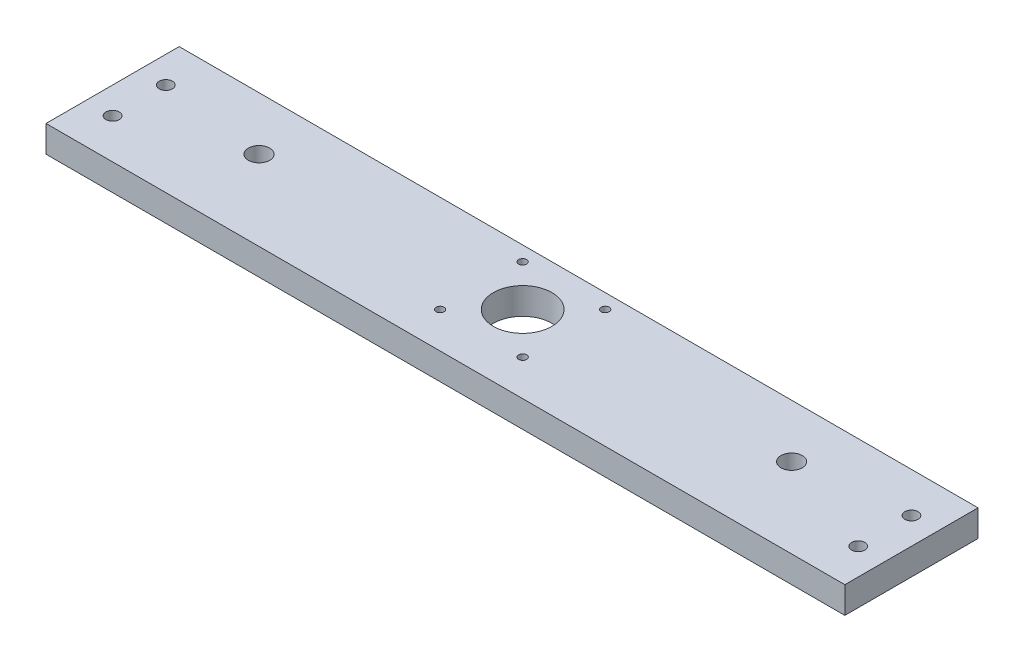
ISO-10303-21;
HEADER;
FILE_DESCRIPTION(('STEP AP214'),'2;1');
FILE_NAME('part.step','',(''),(''),'','','');
FILE_SCHEMA(('AUTOMOTIVE_DESIGN { 1 0 10303 214 1 1 1 1 }'));
ENDSEC;
DATA;
#1=APPLICATION_CONTEXT('core data for automotive mechanical design processes');
#2=APPLICATION_PROTOCOL_DEFINITION('international standard','automotive_design',2000,#1);
#3=PRODUCT_CONTEXT('',#1,'mechanical');
#4=PRODUCT('Part','Part','',(#3));
#5=PRODUCT_RELATED_PRODUCT_CATEGORY('part','',(#4));
#6=PRODUCT_DEFINITION_FORMATION('','',#4);
#7=PRODUCT_DEFINITION_CONTEXT('part definition',#1,'design');
#8=PRODUCT_DEFINITION('design','',#6,#7);
#9=PRODUCT_DEFINITION_SHAPE('','',#8);
#10=(LENGTH_UNIT() NAMED_UNIT(*) SI_UNIT(.MILLI.,.METRE.));
#11=(NAMED_UNIT(*) PLANE_ANGLE_UNIT() SI_UNIT($,.RADIAN.));
#12=(NAMED_UNIT(*) SI_UNIT($,.STERADIAN.) SOLID_ANGLE_UNIT());
#13=UNCERTAINTY_MEASURE_WITH_UNIT(LENGTH_MEASURE(1.E-05),#10,'distance_accuracy_value','');
#14=(GEOMETRIC_REPRESENTATION_CONTEXT(3) GLOBAL_UNCERTAINTY_ASSIGNED_CONTEXT((#13)) GLOBAL_UNIT_ASSIGNED_CONTEXT((#10,
#11,#12)) REPRESENTATION_CONTEXT('',''));
#15=CARTESIAN_POINT('',(0.,0.,0.));
#16=DIRECTION('',(0.,0.,1.));
#17=DIRECTION('',(1.,0.,0.));
#18=AXIS2_PLACEMENT_3D('',#15,#16,#17);
#19=CARTESIAN_POINT('',(0.,10.,0.));
#20=DIRECTION('',(0.,1.,0.));
#21=DIRECTION('',(0.,0.,1.));
#22=AXIS2_PLACEMENT_3D('',#19,#20,#21);
#23=PLANE('',#22);
#24=CARTESIAN_POINT('',(15.5,10.,-14.5));
#25=DIRECTION('',(0.,1.,0.));
#26=DIRECTION('',(0.,0.,-1.));
#27=AXIS2_PLACEMENT_3D('',#24,#25,#26);
#28=CIRCLE('',#27,1.5);
#29=CARTESIAN_POINT('',(15.5,10.,-16.));
#30=VERTEX_POINT('',#29);
#31=EDGE_CURVE('E155',#30,#30,#28,.T.);
#32=ORIENTED_EDGE('',*,*,#31,.F.);
#33=EDGE_LOOP('',(#32));
#34=FACE_BOUND('',#33,.T.);
#35=CARTESIAN_POINT('',(-15.5,10.,-14.5));
#36=DIRECTION('',(0.,1.,0.));
#37=DIRECTION('',(0.,0.,1.));
#38=AXIS2_PLACEMENT_3D('',#35,#36,#37);
#39=CIRCLE('',#38,1.5);
#40=CARTESIAN_POINT('',(-15.5,10.,-13.));
#41=VERTEX_POINT('',#40);
#42=EDGE_CURVE('E161',#41,#41,#39,.T.);
#43=ORIENTED_EDGE('',*,*,#42,.F.);
#44=EDGE_LOOP('',(#43));
#45=FACE_BOUND('',#44,.T.);
#46=CARTESIAN_POINT('',(-15.5,10.,16.5));
#47=DIRECTION('',(0.,1.,0.));
#48=DIRECTION('',(0.,0.,-1.));
#49=AXIS2_PLACEMENT_3D('',#46,#47,#48);
#50=CIRCLE('',#49,1.5);
#51=CARTESIAN_POINT('',(-15.5,10.,15.));
#52=VERTEX_POINT('',#51);
#53=EDGE_CURVE('E167',#52,#52,#50,.T.);
#54=ORIENTED_EDGE('',*,*,#53,.F.);
#55=EDGE_LOOP('',(#54));
#56=FACE_BOUND('',#55,.T.);
#57=CARTESIAN_POINT('',(15.5,10.,16.5));
#58=DIRECTION('',(0.,1.,0.));
#59=DIRECTION('',(0.,0.,1.));
#60=AXIS2_PLACEMENT_3D('',#57,#58,#59);
#61=CIRCLE('',#60,1.5);
#62=CARTESIAN_POINT('',(15.5,10.,18.));
#63=VERTEX_POINT('',#62);
#64=EDGE_CURVE('E173',#63,#63,#61,.T.);
#65=ORIENTED_EDGE('',*,*,#64,.F.);
#66=EDGE_LOOP('',(#65));
#67=FACE_BOUND('',#66,.T.);
#68=CARTESIAN_POINT('',(0.,10.,1.));
#69=DIRECTION('',(0.,1.,0.));
#70=DIRECTION('',(0.,0.,1.));
#71=AXIS2_PLACEMENT_3D('',#68,#69,#70);
#72=CIRCLE('',#71,11.);
#73=CARTESIAN_POINT('',(0.,10.,12.));
#74=VERTEX_POINT('',#73);
#75=EDGE_CURVE('E149',#74,#74,#72,.T.);
#76=ORIENTED_EDGE('',*,*,#75,.F.);
#77=EDGE_LOOP('',(#76));
#78=FACE_BOUND('',#77,.T.);
#79=CARTESIAN_POINT('',(140.,10.,-5.));
#80=DIRECTION('',(0.,1.,0.));
#81=DIRECTION('',(0.,0.,-1.));
#82=AXIS2_PLACEMENT_3D('',#79,#80,#81);
#83=CIRCLE('',#82,2.5);
#84=CARTESIAN_POINT('',(140.,10.,-7.49999999999999));
#85=VERTEX_POINT('',#84);
#86=EDGE_CURVE('E131',#85,#85,#83,.T.);
#87=ORIENTED_EDGE('',*,*,#86,.F.);
#88=EDGE_LOOP('',(#87));
#89=FACE_BOUND('',#88,.T.);
#90=CARTESIAN_POINT('',(140.,10.,15.));
#91=DIRECTION('',(0.,1.,0.));
#92=DIRECTION('',(0.,0.,1.));
#93=AXIS2_PLACEMENT_3D('',#90,#91,#92);
#94=CIRCLE('',#93,2.5);
#95=CARTESIAN_POINT('',(140.,10.,17.5));
#96=VERTEX_POINT('',#95);
#97=EDGE_CURVE('E138',#96,#96,#94,.T.);
#98=ORIENTED_EDGE('',*,*,#97,.F.);
#99=EDGE_LOOP('',(#98));
#100=FACE_BOUND('',#99,.T.);
#101=CARTESIAN_POINT('',(-140.,10.,15.));
#102=DIRECTION('',(0.,1.,0.));
#103=DIRECTION('',(0.,0.,-1.));
#104=AXIS2_PLACEMENT_3D('',#101,#102,#103);
#105=CIRCLE('',#104,2.5);
#106=CARTESIAN_POINT('',(-140.,10.,12.5));
#107=VERTEX_POINT('',#106);
#108=EDGE_CURVE('E144',#107,#107,#105,.T.);
#109=ORIENTED_EDGE('',*,*,#108,.F.);
#110=EDGE_LOOP('',(#109));
#111=FACE_BOUND('',#110,.T.);
#112=CARTESIAN_POINT('',(-140.,10.,-4.99999999999996));
#113=DIRECTION('',(0.,1.,0.));
#114=DIRECTION('',(0.,0.,1.));
#115=AXIS2_PLACEMENT_3D('',#112,#113,#114);
#116=CIRCLE('',#115,2.5);
#117=CARTESIAN_POINT('',(-140.,10.,-2.49999999999997));
#118=VERTEX_POINT('',#117);
#119=EDGE_CURVE('E125',#118,#118,#116,.T.);
#120=ORIENTED_EDGE('',*,*,#119,.F.);
#121=EDGE_LOOP('',(#120));
#122=FACE_BOUND('',#121,.T.);
#123=CARTESIAN_POINT('',(-100.,10.,0.));
#124=DIRECTION('',(0.,1.,0.));
#125=DIRECTION('',(0.,0.,1.));
#126=AXIS2_PLACEMENT_3D('',#123,#124,#125);
#127=CIRCLE('',#126,4.00000000000001);
#128=CARTESIAN_POINT('',(-100.,10.,4.00000000000002));
#129=VERTEX_POINT('',#128);
#130=EDGE_CURVE('E101',#129,#129,#127,.T.);
#131=ORIENTED_EDGE('',*,*,#130,.F.);
#132=EDGE_LOOP('',(#131));
#133=FACE_BOUND('',#132,.T.);
#134=DIRECTION('',(0.,0.,1.));
#135=VECTOR('',#134,1.);
#136=CARTESIAN_POINT('',(-150.,10.,30.));
#137=LINE('',#136,#135);
#138=CARTESIAN_POINT('',(-150.,10.,-20.));
#139=VERTEX_POINT('',#138);
#140=CARTESIAN_POINT('',(-150.,10.,30.));
#141=VERTEX_POINT('',#140);
#142=EDGE_CURVE('E86',#139,#141,#137,.T.);
#143=ORIENTED_EDGE('',*,*,#142,.T.);
#144=DIRECTION('',(1.,0.,0.));
#145=VECTOR('',#144,1.);
#146=CARTESIAN_POINT('',(150.,10.,30.));
#147=LINE('',#146,#145);
#148=CARTESIAN_POINT('',(150.,10.,30.));
#149=VERTEX_POINT('',#148);
#150=EDGE_CURVE('E81',#141,#149,#147,.T.);
#151=ORIENTED_EDGE('',*,*,#150,.T.);
#152=DIRECTION('',(0.,0.,-1.));
#153=VECTOR('',#152,1.);
#154=CARTESIAN_POINT('',(150.,10.,30.));
#155=LINE('',#154,#153);
#156=CARTESIAN_POINT('',(150.,10.,-20.));
#157=VERTEX_POINT('',#156);
#158=EDGE_CURVE('E84',#149,#157,#155,.T.);
#159=ORIENTED_EDGE('',*,*,#158,.T.);
#160=DIRECTION('',(-1.,0.,0.));
#161=VECTOR('',#160,1.);
#162=CARTESIAN_POINT('',(150.,10.,-20.));
#163=LINE('',#162,#161);
#164=EDGE_CURVE('E51',#157,#139,#163,.T.);
#165=ORIENTED_EDGE('',*,*,#164,.T.);
#166=EDGE_LOOP('',(#143,#151,#159,#165));
#167=FACE_BOUND('',#166,.T.);
#168=CARTESIAN_POINT('',(100.,10.,0.));
#169=DIRECTION('',(0.,1.,0.));
#170=DIRECTION('',(0.,0.,-1.));
#171=AXIS2_PLACEMENT_3D('',#168,#169,#170);
#172=CIRCLE('',#171,3.99999999999999);
#173=CARTESIAN_POINT('',(100.,10.,-4.));
#174=VERTEX_POINT('',#173);
#175=EDGE_CURVE('E116',#174,#174,#172,.T.);
#176=ORIENTED_EDGE('',*,*,#175,.F.);
#177=EDGE_LOOP('',(#176));
#178=FACE_BOUND('',#177,.T.);
#179=ADVANCED_FACE('F34',(#34,#45,#56,#67,#78,#89,#100,#111,#122,#133,#167,#178),#23,.T.);
#180=CARTESIAN_POINT('',(0.,0.,0.));
#181=DIRECTION('',(0.,1.,0.));
#182=DIRECTION('',(0.,0.,1.));
#183=AXIS2_PLACEMENT_3D('',#180,#181,#182);
#184=PLANE('',#183);
#185=CARTESIAN_POINT('',(15.5,0.,-14.5));
#186=DIRECTION('',(0.,1.,0.));
#187=DIRECTION('',(0.,0.,-1.));
#188=AXIS2_PLACEMENT_3D('',#185,#186,#187);
#189=CIRCLE('',#188,1.5);
#190=CARTESIAN_POINT('',(15.5,0.,-16.));
#191=VERTEX_POINT('',#190);
#192=EDGE_CURVE('E158',#191,#191,#189,.T.);
#193=ORIENTED_EDGE('',*,*,#192,.T.);
#194=EDGE_LOOP('',(#193));
#195=FACE_BOUND('',#194,.T.);
#196=CARTESIAN_POINT('',(-15.5,0.,-14.5));
#197=DIRECTION('',(0.,1.,0.));
#198=DIRECTION('',(0.,0.,1.));
#199=AXIS2_PLACEMENT_3D('',#196,#197,#198);
#200=CIRCLE('',#199,1.5);
#201=CARTESIAN_POINT('',(-15.5,0.,-13.));
#202=VERTEX_POINT('',#201);
#203=EDGE_CURVE('E164',#202,#202,#200,.T.);
#204=ORIENTED_EDGE('',*,*,#203,.T.);
#205=EDGE_LOOP('',(#204));
#206=FACE_BOUND('',#205,.T.);
#207=CARTESIAN_POINT('',(-15.5,0.,16.5));
#208=DIRECTION('',(0.,1.,0.));
#209=DIRECTION('',(0.,0.,-1.));
#210=AXIS2_PLACEMENT_3D('',#207,#208,#209);
#211=CIRCLE('',#210,1.5);
#212=CARTESIAN_POINT('',(-15.5,0.,15.));
#213=VERTEX_POINT('',#212);
#214=EDGE_CURVE('E170',#213,#213,#211,.T.);
#215=ORIENTED_EDGE('',*,*,#214,.T.);
#216=EDGE_LOOP('',(#215));
#217=FACE_BOUND('',#216,.T.);
#218=CARTESIAN_POINT('',(15.5,0.,16.5));
#219=DIRECTION('',(0.,1.,0.));
#220=DIRECTION('',(0.,0.,1.));
#221=AXIS2_PLACEMENT_3D('',#218,#219,#220);
#222=CIRCLE('',#221,1.5);
#223=CARTESIAN_POINT('',(15.5,0.,18.));
#224=VERTEX_POINT('',#223);
#225=EDGE_CURVE('E152',#224,#224,#222,.T.);
#226=ORIENTED_EDGE('',*,*,#225,.T.);
#227=EDGE_LOOP('',(#226));
#228=FACE_BOUND('',#227,.T.);
#229=CARTESIAN_POINT('',(0.,0.,1.));
#230=DIRECTION('',(0.,1.,0.));
#231=DIRECTION('',(0.,0.,1.));
#232=AXIS2_PLACEMENT_3D('',#229,#230,#231);
#233=CIRCLE('',#232,11.);
#234=CARTESIAN_POINT('',(0.,0.,12.));
#235=VERTEX_POINT('',#234);
#236=EDGE_CURVE('E135',#235,#235,#233,.T.);
#237=ORIENTED_EDGE('',*,*,#236,.T.);
#238=EDGE_LOOP('',(#237));
#239=FACE_BOUND('',#238,.T.);
#240=CARTESIAN_POINT('',(140.,0.,-5.));
#241=DIRECTION('',(0.,1.,0.));
#242=DIRECTION('',(0.,0.,-1.));
#243=AXIS2_PLACEMENT_3D('',#240,#241,#242);
#244=CIRCLE('',#243,2.5);
#245=CARTESIAN_POINT('',(140.,0.,-7.49999999999999));
#246=VERTEX_POINT('',#245);
#247=EDGE_CURVE('E134',#246,#246,#244,.T.);
#248=ORIENTED_EDGE('',*,*,#247,.T.);
#249=EDGE_LOOP('',(#248));
#250=FACE_BOUND('',#249,.T.);
#251=CARTESIAN_POINT('',(140.,0.,15.));
#252=DIRECTION('',(0.,1.,0.));
#253=DIRECTION('',(0.,0.,1.));
#254=AXIS2_PLACEMENT_3D('',#251,#252,#253);
#255=CIRCLE('',#254,2.5);
#256=CARTESIAN_POINT('',(140.,0.,17.5));
#257=VERTEX_POINT('',#256);
#258=EDGE_CURVE('E141',#257,#257,#255,.T.);
#259=ORIENTED_EDGE('',*,*,#258,.T.);
#260=EDGE_LOOP('',(#259));
#261=FACE_BOUND('',#260,.T.);
#262=CARTESIAN_POINT('',(-140.,0.,15.));
#263=DIRECTION('',(0.,1.,0.));
#264=DIRECTION('',(0.,0.,-1.));
#265=AXIS2_PLACEMENT_3D('',#262,#263,#264);
#266=CIRCLE('',#265,2.5);
#267=CARTESIAN_POINT('',(-140.,0.,12.5));
#268=VERTEX_POINT('',#267);
#269=EDGE_CURVE('E128',#268,#268,#266,.T.);
#270=ORIENTED_EDGE('',*,*,#269,.T.);
#271=EDGE_LOOP('',(#270));
#272=FACE_BOUND('',#271,.T.);
#273=CARTESIAN_POINT('',(-140.,0.,-4.99999999999996));
#274=DIRECTION('',(0.,1.,0.));
#275=DIRECTION('',(0.,0.,1.));
#276=AXIS2_PLACEMENT_3D('',#273,#274,#275);
#277=CIRCLE('',#276,2.5);
#278=CARTESIAN_POINT('',(-140.,0.,-2.49999999999997));
#279=VERTEX_POINT('',#278);
#280=EDGE_CURVE('E122',#279,#279,#277,.T.);
#281=ORIENTED_EDGE('',*,*,#280,.T.);
#282=EDGE_LOOP('',(#281));
#283=FACE_BOUND('',#282,.T.);
#284=DIRECTION('',(0.,0.,1.));
#285=VECTOR('',#284,1.);
#286=CARTESIAN_POINT('',(-150.,0.,30.));
#287=LINE('',#286,#285);
#288=CARTESIAN_POINT('',(-150.,0.,-20.));
#289=VERTEX_POINT('',#288);
#290=CARTESIAN_POINT('',(-150.,0.,30.));
#291=VERTEX_POINT('',#290);
#292=EDGE_CURVE('E98',#289,#291,#287,.T.);
#293=ORIENTED_EDGE('',*,*,#292,.F.);
#294=DIRECTION('',(-1.,0.,0.));
#295=VECTOR('',#294,1.);
#296=CARTESIAN_POINT('',(150.,0.,-20.));
#297=LINE('',#296,#295);
#298=CARTESIAN_POINT('',(150.,0.,-20.));
#299=VERTEX_POINT('',#298);
#300=EDGE_CURVE('E74',#299,#289,#297,.T.);
#301=ORIENTED_EDGE('',*,*,#300,.F.);
#302=DIRECTION('',(0.,0.,-1.));
#303=VECTOR('',#302,1.);
#304=CARTESIAN_POINT('',(150.,0.,30.));
#305=LINE('',#304,#303);
#306=CARTESIAN_POINT('',(150.,0.,30.));
#307=VERTEX_POINT('',#306);
#308=EDGE_CURVE('E68',#307,#299,#305,.T.);
#309=ORIENTED_EDGE('',*,*,#308,.F.);
#310=DIRECTION('',(1.,0.,0.));
#311=VECTOR('',#310,1.);
#312=CARTESIAN_POINT('',(150.,0.,30.));
#313=LINE('',#312,#311);
#314=EDGE_CURVE('E90',#291,#307,#313,.T.);
#315=ORIENTED_EDGE('',*,*,#314,.F.);
#316=EDGE_LOOP('',(#293,#301,#309,#315));
#317=FACE_BOUND('',#316,.T.);
#318=CARTESIAN_POINT('',(-100.,0.,0.));
#319=DIRECTION('',(0.,1.,0.));
#320=DIRECTION('',(0.,0.,1.));
#321=AXIS2_PLACEMENT_3D('',#318,#319,#320);
#322=CIRCLE('',#321,4.00000000000001);
#323=CARTESIAN_POINT('',(-100.,0.,4.00000000000002));
#324=VERTEX_POINT('',#323);
#325=EDGE_CURVE('E113',#324,#324,#322,.T.);
#326=ORIENTED_EDGE('',*,*,#325,.T.);
#327=EDGE_LOOP('',(#326));
#328=FACE_BOUND('',#327,.T.);
#329=CARTESIAN_POINT('',(100.,0.,0.));
#330=DIRECTION('',(0.,1.,0.));
#331=DIRECTION('',(0.,0.,-1.));
#332=AXIS2_PLACEMENT_3D('',#329,#330,#331);
#333=CIRCLE('',#332,3.99999999999999);
#334=CARTESIAN_POINT('',(100.,0.,-4.));
#335=VERTEX_POINT('',#334);
#336=EDGE_CURVE('E119',#335,#335,#333,.T.);
#337=ORIENTED_EDGE('',*,*,#336,.T.);
#338=EDGE_LOOP('',(#337));
#339=FACE_BOUND('',#338,.T.);
#340=ADVANCED_FACE('F109',(#195,#206,#217,#228,#239,#250,#261,#272,#283,#317,#328,#339),#184,.F.);
#341=CARTESIAN_POINT('',(-150.,10.,30.));
#342=DIRECTION('',(1.,0.,0.));
#343=DIRECTION('',(0.,0.,-1.));
#344=AXIS2_PLACEMENT_3D('',#341,#342,#343);
#345=PLANE('',#344);
#346=ORIENTED_EDGE('',*,*,#292,.T.);
#347=DIRECTION('',(0.,-1.,0.));
#348=VECTOR('',#347,1.);
#349=CARTESIAN_POINT('',(-150.,10.,30.));
#350=LINE('',#349,#348);
#351=EDGE_CURVE('E11',#141,#291,#350,.T.);
#352=ORIENTED_EDGE('',*,*,#351,.F.);
#353=ORIENTED_EDGE('',*,*,#142,.F.);
#354=DIRECTION('',(0.,-1.,0.));
#355=VECTOR('',#354,1.);
#356=CARTESIAN_POINT('',(-150.,10.,-20.));
#357=LINE('',#356,#355);
#358=EDGE_CURVE('E94',#139,#289,#357,.T.);
#359=ORIENTED_EDGE('',*,*,#358,.T.);
#360=EDGE_LOOP('',(#346,#352,#353,#359));
#361=FACE_BOUND('',#360,.T.);
#362=ADVANCED_FACE('F36',(#361),#345,.F.);
#363=CARTESIAN_POINT('',(150.,10.,30.));
#364=DIRECTION('',(0.,0.,-1.));
#365=DIRECTION('',(-1.,0.,0.));
#366=AXIS2_PLACEMENT_3D('',#363,#364,#365);
#367=PLANE('',#366);
#368=ORIENTED_EDGE('',*,*,#314,.T.);
#369=DIRECTION('',(0.,-1.,0.));
#370=VECTOR('',#369,1.);
#371=CARTESIAN_POINT('',(150.,10.,30.));
#372=LINE('',#371,#370);
#373=EDGE_CURVE('E43',#149,#307,#372,.T.);
#374=ORIENTED_EDGE('',*,*,#373,.F.);
#375=ORIENTED_EDGE('',*,*,#150,.F.);
#376=ORIENTED_EDGE('',*,*,#351,.T.);
#377=EDGE_LOOP('',(#368,#374,#375,#376));
#378=FACE_BOUND('',#377,.T.);
#379=ADVANCED_FACE('F89',(#378),#367,.F.);
#380=CARTESIAN_POINT('',(150.,10.,30.));
#381=DIRECTION('',(-1.,0.,0.));
#382=DIRECTION('',(0.,0.,1.));
#383=AXIS2_PLACEMENT_3D('',#380,#381,#382);
#384=PLANE('',#383);
#385=ORIENTED_EDGE('',*,*,#308,.T.);
#386=DIRECTION('',(0.,-1.,0.));
#387=VECTOR('',#386,1.);
#388=CARTESIAN_POINT('',(150.,10.,-20.));
#389=LINE('',#388,#387);
#390=EDGE_CURVE('E91',#157,#299,#389,.T.);
#391=ORIENTED_EDGE('',*,*,#390,.F.);
#392=ORIENTED_EDGE('',*,*,#158,.F.);
#393=ORIENTED_EDGE('',*,*,#373,.T.);
#394=EDGE_LOOP('',(#385,#391,#392,#393));
#395=FACE_BOUND('',#394,.T.);
#396=ADVANCED_FACE('F92',(#395),#384,.F.);
#397=CARTESIAN_POINT('',(150.,10.,-20.));
#398=DIRECTION('',(0.,0.,1.));
#399=DIRECTION('',(1.,0.,0.));
#400=AXIS2_PLACEMENT_3D('',#397,#398,#399);
#401=PLANE('',#400);
#402=ORIENTED_EDGE('',*,*,#300,.T.);
#403=ORIENTED_EDGE('',*,*,#358,.F.);
#404=ORIENTED_EDGE('',*,*,#164,.F.);
#405=ORIENTED_EDGE('',*,*,#390,.T.);
#406=EDGE_LOOP('',(#402,#403,#404,#405));
#407=FACE_BOUND('',#406,.T.);
#408=ADVANCED_FACE('F106',(#407),#401,.F.);
#409=CARTESIAN_POINT('',(-100.,10.,0.));
#410=DIRECTION('',(0.,-1.,0.));
#411=DIRECTION('',(0.,0.,-1.));
#412=AXIS2_PLACEMENT_3D('',#409,#410,#411);
#413=CYLINDRICAL_SURFACE('',#412,4.00000000000001);
#414=ORIENTED_EDGE('',*,*,#130,.T.);
#415=EDGE_LOOP('',(#414));
#416=FACE_BOUND('',#415,.T.);
#417=ORIENTED_EDGE('',*,*,#325,.F.);
#418=EDGE_LOOP('',(#417));
#419=FACE_BOUND('',#418,.T.);
#420=ADVANCED_FACE('F205',(#416,#419),#413,.F.);
#421=CARTESIAN_POINT('',(100.,10.,0.));
#422=DIRECTION('',(0.,-1.,0.));
#423=DIRECTION('',(0.,0.,-1.));
#424=AXIS2_PLACEMENT_3D('',#421,#422,#423);
#425=CYLINDRICAL_SURFACE('',#424,3.99999999999999);
#426=ORIENTED_EDGE('',*,*,#175,.T.);
#427=EDGE_LOOP('',(#426));
#428=FACE_BOUND('',#427,.T.);
#429=ORIENTED_EDGE('',*,*,#336,.F.);
#430=EDGE_LOOP('',(#429));
#431=FACE_BOUND('',#430,.T.);
#432=ADVANCED_FACE('F208',(#428,#431),#425,.F.);
#433=CARTESIAN_POINT('',(-140.,0.,-4.99999999999996));
#434=DIRECTION('',(0.,1.,0.));
#435=DIRECTION('',(0.,0.,1.));
#436=AXIS2_PLACEMENT_3D('',#433,#434,#435);
#437=CYLINDRICAL_SURFACE('',#436,2.5);
#438=ORIENTED_EDGE('',*,*,#280,.F.);
#439=EDGE_LOOP('',(#438));
#440=FACE_BOUND('',#439,.T.);
#441=ORIENTED_EDGE('',*,*,#119,.T.);
#442=EDGE_LOOP('',(#441));
#443=FACE_BOUND('',#442,.T.);
#444=ADVANCED_FACE('F218',(#440,#443),#437,.F.);
#445=CARTESIAN_POINT('',(-140.,0.,15.));
#446=DIRECTION('',(0.,1.,0.));
#447=DIRECTION('',(0.,0.,1.));
#448=AXIS2_PLACEMENT_3D('',#445,#446,#447);
#449=CYLINDRICAL_SURFACE('',#448,2.5);
#450=ORIENTED_EDGE('',*,*,#269,.F.);
#451=EDGE_LOOP('',(#450));
#452=FACE_BOUND('',#451,.T.);
#453=ORIENTED_EDGE('',*,*,#108,.T.);
#454=EDGE_LOOP('',(#453));
#455=FACE_BOUND('',#454,.T.);
#456=ADVANCED_FACE('F224',(#452,#455),#449,.F.);
#457=CARTESIAN_POINT('',(140.,0.,15.));
#458=DIRECTION('',(0.,1.,0.));
#459=DIRECTION('',(0.,0.,1.));
#460=AXIS2_PLACEMENT_3D('',#457,#458,#459);
#461=CYLINDRICAL_SURFACE('',#460,2.5);
#462=ORIENTED_EDGE('',*,*,#258,.F.);
#463=EDGE_LOOP('',(#462));
#464=FACE_BOUND('',#463,.T.);
#465=ORIENTED_EDGE('',*,*,#97,.T.);
#466=EDGE_LOOP('',(#465));
#467=FACE_BOUND('',#466,.T.);
#468=ADVANCED_FACE('F257',(#464,#467),#461,.F.);
#469=CARTESIAN_POINT('',(140.,0.,-5.));
#470=DIRECTION('',(0.,1.,0.));
#471=DIRECTION('',(0.,0.,1.));
#472=AXIS2_PLACEMENT_3D('',#469,#470,#471);
#473=CYLINDRICAL_SURFACE('',#472,2.5);
#474=ORIENTED_EDGE('',*,*,#247,.F.);
#475=EDGE_LOOP('',(#474));
#476=FACE_BOUND('',#475,.T.);
#477=ORIENTED_EDGE('',*,*,#86,.T.);
#478=EDGE_LOOP('',(#477));
#479=FACE_BOUND('',#478,.T.);
#480=ADVANCED_FACE('F252',(#476,#479),#473,.F.);
#481=CARTESIAN_POINT('',(0.,0.,1.));
#482=DIRECTION('',(0.,1.,0.));
#483=DIRECTION('',(0.,0.,1.));
#484=AXIS2_PLACEMENT_3D('',#481,#482,#483);
#485=CYLINDRICAL_SURFACE('',#484,11.);
#486=ORIENTED_EDGE('',*,*,#236,.F.);
#487=EDGE_LOOP('',(#486));
#488=FACE_BOUND('',#487,.T.);
#489=ORIENTED_EDGE('',*,*,#75,.T.);
#490=EDGE_LOOP('',(#489));
#491=FACE_BOUND('',#490,.T.);
#492=ADVANCED_FACE('F185',(#488,#491),#485,.F.);
#493=CARTESIAN_POINT('',(15.5,0.,16.5));
#494=DIRECTION('',(0.,1.,0.));
#495=DIRECTION('',(0.,0.,1.));
#496=AXIS2_PLACEMENT_3D('',#493,#494,#495);
#497=CYLINDRICAL_SURFACE('',#496,1.5);
#498=ORIENTED_EDGE('',*,*,#225,.F.);
#499=EDGE_LOOP('',(#498));
#500=FACE_BOUND('',#499,.T.);
#501=ORIENTED_EDGE('',*,*,#64,.T.);
#502=EDGE_LOOP('',(#501));
#503=FACE_BOUND('',#502,.T.);
#504=ADVANCED_FACE('F181',(#500,#503),#497,.F.);
#505=CARTESIAN_POINT('',(-15.5,0.,16.5));
#506=DIRECTION('',(0.,1.,0.));
#507=DIRECTION('',(0.,0.,1.));
#508=AXIS2_PLACEMENT_3D('',#505,#506,#507);
#509=CYLINDRICAL_SURFACE('',#508,1.5);
#510=ORIENTED_EDGE('',*,*,#214,.F.);
#511=EDGE_LOOP('',(#510));
#512=FACE_BOUND('',#511,.T.);
#513=ORIENTED_EDGE('',*,*,#53,.T.);
#514=EDGE_LOOP('',(#513));
#515=FACE_BOUND('',#514,.T.);
#516=ADVANCED_FACE('F184',(#512,#515),#509,.F.);
#517=CARTESIAN_POINT('',(-15.5,0.,-14.5));
#518=DIRECTION('',(0.,1.,0.));
#519=DIRECTION('',(0.,0.,1.));
#520=AXIS2_PLACEMENT_3D('',#517,#518,#519);
#521=CYLINDRICAL_SURFACE('',#520,1.5);
#522=ORIENTED_EDGE('',*,*,#203,.F.);
#523=EDGE_LOOP('',(#522));
#524=FACE_BOUND('',#523,.T.);
#525=ORIENTED_EDGE('',*,*,#42,.T.);
#526=EDGE_LOOP('',(#525));
#527=FACE_BOUND('',#526,.T.);
#528=ADVANCED_FACE('F325',(#524,#527),#521,.F.);
#529=CARTESIAN_POINT('',(15.5,0.,-14.5));
#530=DIRECTION('',(0.,1.,0.));
#531=DIRECTION('',(0.,0.,1.));
#532=AXIS2_PLACEMENT_3D('',#529,#530,#531);
#533=CYLINDRICAL_SURFACE('',#532,1.5);
#534=ORIENTED_EDGE('',*,*,#192,.F.);
#535=EDGE_LOOP('',(#534));
#536=FACE_BOUND('',#535,.T.);
#537=ORIENTED_EDGE('',*,*,#31,.T.);
#538=EDGE_LOOP('',(#537));
#539=FACE_BOUND('',#538,.T.);
#540=ADVANCED_FACE('F322',(#536,#539),#533,.F.);
#541=CLOSED_SHELL('',(#179,#340,#362,#379,#396,#408,#420,#432,#444,#456,#468,#480,#492,#504,
#516,#528,#540));
#542=MANIFOLD_SOLID_BREP('B2',#541);
#543=ADVANCED_BREP_SHAPE_REPRESENTATION('',(#18,#542),#14);
#544=SHAPE_DEFINITION_REPRESENTATION(#9,#543);
ENDSEC;
END-ISO-10303-21;
